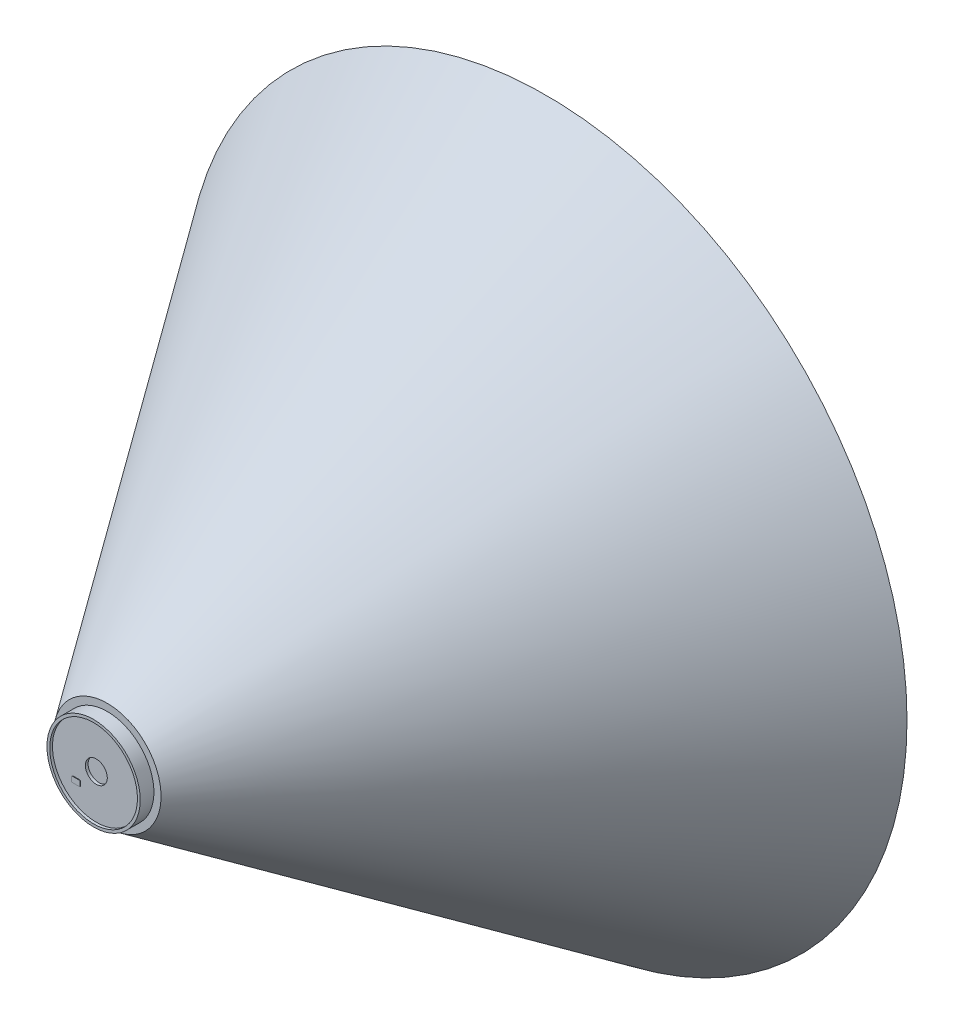
ISO-10303-21;
HEADER;
FILE_DESCRIPTION(('STEP AP214'),'2;1');
FILE_NAME('part.step','',(''),(''),'','','');
FILE_SCHEMA(('AUTOMOTIVE_DESIGN { 1 0 10303 214 1 1 1 1 }'));
ENDSEC;
DATA;
#1=APPLICATION_CONTEXT('core data for automotive mechanical design processes');
#2=APPLICATION_PROTOCOL_DEFINITION('international standard','automotive_design',2000,#1);
#3=PRODUCT_CONTEXT('',#1,'mechanical');
#4=PRODUCT('Part','Part','',(#3));
#5=PRODUCT_RELATED_PRODUCT_CATEGORY('part','',(#4));
#6=PRODUCT_DEFINITION_FORMATION('','',#4);
#7=PRODUCT_DEFINITION_CONTEXT('part definition',#1,'design');
#8=PRODUCT_DEFINITION('design','',#6,#7);
#9=PRODUCT_DEFINITION_SHAPE('','',#8);
#10=(LENGTH_UNIT() NAMED_UNIT(*) SI_UNIT(.MILLI.,.METRE.));
#11=(NAMED_UNIT(*) PLANE_ANGLE_UNIT() SI_UNIT($,.RADIAN.));
#12=(NAMED_UNIT(*) SI_UNIT($,.STERADIAN.) SOLID_ANGLE_UNIT());
#13=UNCERTAINTY_MEASURE_WITH_UNIT(LENGTH_MEASURE(1.E-05),#10,'distance_accuracy_value','');
#14=(GEOMETRIC_REPRESENTATION_CONTEXT(3) GLOBAL_UNCERTAINTY_ASSIGNED_CONTEXT((#13)) GLOBAL_UNIT_ASSIGNED_CONTEXT((#10,
#11,#12)) REPRESENTATION_CONTEXT('',''));
#15=CARTESIAN_POINT('',(0.,0.,0.));
#16=DIRECTION('',(0.,0.,1.));
#17=DIRECTION('',(1.,0.,0.));
#18=AXIS2_PLACEMENT_3D('',#15,#16,#17);
#19=CARTESIAN_POINT('',(0.,0.,0.));
#20=DIRECTION('',(0.,0.,-1.));
#21=DIRECTION('',(-1.,0.,0.));
#22=AXIS2_PLACEMENT_3D('',#19,#20,#21);
#23=PLANE('',#22);
#24=CARTESIAN_POINT('',(0.,0.,0.));
#25=DIRECTION('',(0.,0.,-1.));
#26=DIRECTION('',(-1.,0.,0.));
#27=AXIS2_PLACEMENT_3D('',#24,#25,#26);
#28=CIRCLE('',#27,425.);
#29=CARTESIAN_POINT('',(-425.,0.,0.));
#30=VERTEX_POINT('',#29);
#31=EDGE_CURVE('E11',#30,#30,#28,.F.);
#32=ORIENTED_EDGE('',*,*,#31,.F.);
#33=EDGE_LOOP('',(#32));
#34=FACE_BOUND('',#33,.T.);
#35=CARTESIAN_POINT('',(0.,0.,0.));
#36=DIRECTION('',(0.,0.,1.));
#37=DIRECTION('',(1.,0.,0.));
#38=AXIS2_PLACEMENT_3D('',#35,#36,#37);
#39=CIRCLE('',#38,490.113460197904);
#40=CARTESIAN_POINT('',(-490.113460197904,0.,0.));
#41=VERTEX_POINT('',#40);
#42=EDGE_CURVE('E50',#41,#41,#39,.T.);
#43=ORIENTED_EDGE('',*,*,#42,.T.);
#44=EDGE_LOOP('',(#43));
#45=FACE_BOUND('',#44,.T.);
#46=ADVANCED_FACE('F41',(#34,#45),#23,.F.);
#47=CARTESIAN_POINT('',(0.,0.,-4000.));
#48=DIRECTION('',(0.,0.,-1.));
#49=DIRECTION('',(-1.,0.,0.));
#50=AXIS2_PLACEMENT_3D('',#47,#48,#49);
#51=CONICAL_SURFACE('',#50,3290.94361303677,0.61086523819802);
#52=CARTESIAN_POINT('',(0.,0.,-4000.));
#53=DIRECTION('',(0.,0.,1.));
#54=DIRECTION('',(1.,0.,0.));
#55=AXIS2_PLACEMENT_3D('',#52,#53,#54);
#56=CIRCLE('',#55,3290.94361303677);
#57=CARTESIAN_POINT('',(-3290.94361303677,0.,-4000.));
#58=VERTEX_POINT('',#57);
#59=EDGE_CURVE('E200',#58,#58,#56,.T.);
#60=CARTESIAN_POINT('',(-490.113460197904,0.,0.));
#61=CARTESIAN_POINT('',(-519.288774289975,0.,-41.6666666666667));
#62=CARTESIAN_POINT('',(-548.464088382047,0.,-83.3333333333333));
#63=CARTESIAN_POINT('',(-606.81471656619,0.,-166.666666666667));
#64=CARTESIAN_POINT('',(-635.990030658262,0.,-208.333333333333));
#65=CARTESIAN_POINT('',(-694.340658842405,0.,-291.666666666667));
#66=CARTESIAN_POINT('',(-723.515972934476,0.,-333.333333333333));
#67=CARTESIAN_POINT('',(-781.866601118619,0.,-416.666666666667));
#68=CARTESIAN_POINT('',(-811.041915210691,0.,-458.333333333333));
#69=CARTESIAN_POINT('',(-869.392543394834,0.,-541.666666666667));
#70=CARTESIAN_POINT('',(-898.567857486905,0.,-583.333333333333));
#71=CARTESIAN_POINT('',(-956.918485671048,0.,-666.666666666667));
#72=CARTESIAN_POINT('',(-986.09379976312,0.,-708.333333333333));
#73=CARTESIAN_POINT('',(-1044.44442794726,0.,-791.666666666667));
#74=CARTESIAN_POINT('',(-1073.61974203933,0.,-833.333333333333));
#75=CARTESIAN_POINT('',(-1131.97037022348,0.,-916.666666666667));
#76=CARTESIAN_POINT('',(-1161.14568431555,0.,-958.333333333333));
#77=CARTESIAN_POINT('',(-1219.49631249969,0.,-1041.66666666667));
#78=CARTESIAN_POINT('',(-1248.67162659176,0.,-1083.33333333333));
#79=CARTESIAN_POINT('',(-1307.02225477591,0.,-1166.66666666667));
#80=CARTESIAN_POINT('',(-1336.19756886798,0.,-1208.33333333333));
#81=CARTESIAN_POINT('',(-1394.54819705212,0.,-1291.66666666667));
#82=CARTESIAN_POINT('',(-1423.72351114419,0.,-1333.33333333333));
#83=CARTESIAN_POINT('',(-1482.07413932834,0.,-1416.66666666667));
#84=CARTESIAN_POINT('',(-1511.24945342041,0.,-1458.33333333333));
#85=CARTESIAN_POINT('',(-1569.60008160455,0.,-1541.66666666667));
#86=CARTESIAN_POINT('',(-1598.77539569662,0.,-1583.33333333333));
#87=CARTESIAN_POINT('',(-1657.12602388077,0.,-1666.66666666667));
#88=CARTESIAN_POINT('',(-1686.30133797284,0.,-1708.33333333333));
#89=CARTESIAN_POINT('',(-1744.65196615698,0.,-1791.66666666667));
#90=CARTESIAN_POINT('',(-1773.82728024905,0.,-1833.33333333333));
#91=CARTESIAN_POINT('',(-1832.17790843319,0.,-1916.66666666667));
#92=CARTESIAN_POINT('',(-1861.35322252527,0.,-1958.33333333333));
#93=CARTESIAN_POINT('',(-1919.70385070941,0.,-2041.66666666667));
#94=CARTESIAN_POINT('',(-1948.87916480148,0.,-2083.33333333333));
#95=CARTESIAN_POINT('',(-2007.22979298562,0.,-2166.66666666667));
#96=CARTESIAN_POINT('',(-2036.40510707769,0.,-2208.33333333333));
#97=CARTESIAN_POINT('',(-2094.75573526184,0.,-2291.66666666667));
#98=CARTESIAN_POINT('',(-2123.93104935391,0.,-2333.33333333333));
#99=CARTESIAN_POINT('',(-2182.28167753805,0.,-2416.66666666667));
#100=CARTESIAN_POINT('',(-2211.45699163012,0.,-2458.33333333333));
#101=CARTESIAN_POINT('',(-2269.80761981427,0.,-2541.66666666667));
#102=CARTESIAN_POINT('',(-2298.98293390634,0.,-2583.33333333333));
#103=CARTESIAN_POINT('',(-2357.33356209048,0.,-2666.66666666667));
#104=CARTESIAN_POINT('',(-2386.50887618255,0.,-2708.33333333333));
#105=CARTESIAN_POINT('',(-2444.8595043667,0.,-2791.66666666667));
#106=CARTESIAN_POINT('',(-2474.03481845877,0.,-2833.33333333333));
#107=CARTESIAN_POINT('',(-2532.38544664291,0.,-2916.66666666667));
#108=CARTESIAN_POINT('',(-2561.56076073498,0.,-2958.33333333333));
#109=CARTESIAN_POINT('',(-2619.91138891913,0.,-3041.66666666667));
#110=CARTESIAN_POINT('',(-2649.0867030112,0.,-3083.33333333333));
#111=CARTESIAN_POINT('',(-2707.43733119534,0.,-3166.66666666667));
#112=CARTESIAN_POINT('',(-2736.61264528741,0.,-3208.33333333333));
#113=CARTESIAN_POINT('',(-2794.96327347155,0.,-3291.66666666667));
#114=CARTESIAN_POINT('',(-2824.13858756363,0.,-3333.33333333333));
#115=CARTESIAN_POINT('',(-2882.48921574777,0.,-3416.66666666667));
#116=CARTESIAN_POINT('',(-2911.66452983984,0.,-3458.33333333333));
#117=CARTESIAN_POINT('',(-2970.01515802398,0.,-3541.66666666667));
#118=CARTESIAN_POINT('',(-2999.19047211606,0.,-3583.33333333333));
#119=CARTESIAN_POINT('',(-3057.5411003002,0.,-3666.66666666667));
#120=CARTESIAN_POINT('',(-3086.71641439227,0.,-3708.33333333333));
#121=CARTESIAN_POINT('',(-3145.06704257641,0.,-3791.66666666667));
#122=CARTESIAN_POINT('',(-3174.24235666849,0.,-3833.33333333333));
#123=CARTESIAN_POINT('',(-3232.59298485263,0.,-3916.66666666667));
#124=CARTESIAN_POINT('',(-3261.7682989447,0.,-3958.33333333333));
#125=CARTESIAN_POINT('',(-3290.94361303677,0.,-4000.));
#126=B_SPLINE_CURVE_WITH_KNOTS('',3,(#60,#61,#62,#63,#64,#65,#66,#67,#68,#69,#70,#71,#72,#73,
#74,#75,#76,#77,#78,#79,#80,#81,#82,#83,#84,#85,#86,#87,#88,#89,#90,#91,#92,#93,#94,#95,#96,#97,
#98,#99,#100,#101,#102,#103,#104,#105,#106,#107,#108,#109,#110,#111,#112,#113,#114,#115,#116,
#117,#118,#119,#120,#121,#122,#123,#124,#125),.UNSPECIFIED.,.F.,.F.,(4,2,2,2,2,2,2,2,2,2,2,2,2,
2,2,2,2,2,2,2,2,2,2,2,2,2,2,2,2,2,2,2,4),(0.,152.596823595183,305.193647190365,457.790470785548,
610.38729438073,762.984117975913,915.580941571095,1068.17776516628,1220.77458876146,
1373.37141235664,1525.96823595183,1678.56505954701,1831.16188314219,1983.75870673737,
2136.35553033256,2288.95235392774,2441.54917752292,2594.1460011181,2746.74282471328,
2899.33964830847,3051.93647190365,3204.53329549883,3357.13011909402,3509.7269426892,
3662.32376628438,3814.92058987956,3967.51741347475,4120.11423706993,4272.71106066511,
4425.30788426029,4577.90470785547,4730.50153145066,4883.09835504584),.UNSPECIFIED.);
#127=EDGE_CURVE('BSEAM208',#41,#58,#126,.T.);
#128=ORIENTED_EDGE('',*,*,#42,.F.);
#129=ORIENTED_EDGE('',*,*,#59,.T.);
#130=ORIENTED_EDGE('',*,*,#127,.T.);
#131=ORIENTED_EDGE('',*,*,#127,.F.);
#132=EDGE_LOOP('',(#128,#130,#129,#131));
#133=FACE_BOUND('',#132,.T.);
#134=ADVANCED_FACE('F208',(#133),#51,.T.);
#135=CARTESIAN_POINT('',(0.,0.,-4000.));
#136=DIRECTION('',(0.,0.,1.));
#137=DIRECTION('',(1.,0.,0.));
#138=AXIS2_PLACEMENT_3D('',#135,#136,#137);
#139=PLANE('',#138);
#140=ORIENTED_EDGE('',*,*,#59,.F.);
#141=EDGE_LOOP('',(#140));
#142=FACE_BOUND('',#141,.T.);
#143=ADVANCED_FACE('F211',(#142),#139,.F.);
#144=CARTESIAN_POINT('',(0.,0.,100.));
#145=DIRECTION('',(0.,0.,1.));
#146=DIRECTION('',(1.,0.,0.));
#147=AXIS2_PLACEMENT_3D('',#144,#145,#146);
#148=PLANE('',#147);
#149=CARTESIAN_POINT('',(0.,0.,100.));
#150=DIRECTION('',(0.,0.,1.));
#151=DIRECTION('',(1.,0.,0.));
#152=AXIS2_PLACEMENT_3D('',#149,#150,#151);
#153=CIRCLE('',#152,400.);
#154=CARTESIAN_POINT('',(400.,0.,100.));
#155=VERTEX_POINT('',#154);
#156=EDGE_CURVE('E136',#155,#155,#153,.F.);
#157=ORIENTED_EDGE('',*,*,#156,.F.);
#158=EDGE_LOOP('',(#157));
#159=FACE_BOUND('',#158,.T.);
#160=CARTESIAN_POINT('',(0.,0.,100.));
#161=DIRECTION('',(0.,0.,1.));
#162=DIRECTION('',(1.,0.,0.));
#163=AXIS2_PLACEMENT_3D('',#160,#161,#162);
#164=CIRCLE('',#163,100.);
#165=CARTESIAN_POINT('',(100.,0.,100.));
#166=VERTEX_POINT('',#165);
#167=EDGE_CURVE('E155',#166,#166,#164,.T.);
#168=ORIENTED_EDGE('',*,*,#167,.F.);
#169=EDGE_LOOP('',(#168));
#170=FACE_BOUND('',#169,.T.);
#171=DIRECTION('',(1.,0.,0.));
#172=VECTOR('',#171,1.);
#173=CARTESIAN_POINT('',(-220.,-190.,100.));
#174=LINE('',#173,#172);
#175=CARTESIAN_POINT('',(-215.,-190.,100.));
#176=VERTEX_POINT('',#175);
#177=CARTESIAN_POINT('',(-150.,-190.,100.));
#178=VERTEX_POINT('',#177);
#179=EDGE_CURVE('E135',#176,#178,#174,.T.);
#180=ORIENTED_EDGE('',*,*,#179,.F.);
#181=CARTESIAN_POINT('',(-215.,-185.,100.));
#182=DIRECTION('',(0.,0.,1.));
#183=DIRECTION('',(1.,0.,0.));
#184=AXIS2_PLACEMENT_3D('',#181,#182,#183);
#185=CIRCLE('',#184,5.);
#186=CARTESIAN_POINT('',(-220.,-185.,100.));
#187=VERTEX_POINT('',#186);
#188=EDGE_CURVE('E65',#176,#187,#185,.F.);
#189=ORIENTED_EDGE('',*,*,#188,.T.);
#190=DIRECTION('',(0.,-1.,0.));
#191=VECTOR('',#190,1.);
#192=CARTESIAN_POINT('',(-220.,-140.,100.));
#193=LINE('',#192,#191);
#194=CARTESIAN_POINT('',(-220.,-145.,100.));
#195=VERTEX_POINT('',#194);
#196=EDGE_CURVE('E126',#195,#187,#193,.T.);
#197=ORIENTED_EDGE('',*,*,#196,.F.);
#198=CARTESIAN_POINT('',(-215.,-145.,100.));
#199=DIRECTION('',(0.,0.,1.));
#200=DIRECTION('',(1.,0.,0.));
#201=AXIS2_PLACEMENT_3D('',#198,#199,#200);
#202=CIRCLE('',#201,5.);
#203=CARTESIAN_POINT('',(-215.,-140.,100.));
#204=VERTEX_POINT('',#203);
#205=EDGE_CURVE('E109',#195,#204,#202,.F.);
#206=ORIENTED_EDGE('',*,*,#205,.T.);
#207=DIRECTION('',(-1.,0.,0.));
#208=VECTOR('',#207,1.);
#209=CARTESIAN_POINT('',(-220.,-140.,100.));
#210=LINE('',#209,#208);
#211=CARTESIAN_POINT('',(-150.,-140.,100.));
#212=VERTEX_POINT('',#211);
#213=EDGE_CURVE('E152',#212,#204,#210,.T.);
#214=ORIENTED_EDGE('',*,*,#213,.F.);
#215=CARTESIAN_POINT('',(-150.,-145.,100.));
#216=DIRECTION('',(0.,0.,1.));
#217=DIRECTION('',(1.,0.,0.));
#218=AXIS2_PLACEMENT_3D('',#215,#216,#217);
#219=CIRCLE('',#218,5.);
#220=CARTESIAN_POINT('',(-145.,-145.,100.));
#221=VERTEX_POINT('',#220);
#222=EDGE_CURVE('E119',#212,#221,#219,.F.);
#223=ORIENTED_EDGE('',*,*,#222,.T.);
#224=DIRECTION('',(0.,1.,0.));
#225=VECTOR('',#224,1.);
#226=CARTESIAN_POINT('',(-145.,-140.,100.));
#227=LINE('',#226,#225);
#228=CARTESIAN_POINT('',(-145.,-185.,100.));
#229=VERTEX_POINT('',#228);
#230=EDGE_CURVE('E140',#229,#221,#227,.T.);
#231=ORIENTED_EDGE('',*,*,#230,.F.);
#232=CARTESIAN_POINT('',(-150.,-185.,100.));
#233=DIRECTION('',(0.,0.,1.));
#234=DIRECTION('',(1.,0.,0.));
#235=AXIS2_PLACEMENT_3D('',#232,#233,#234);
#236=CIRCLE('',#235,5.);
#237=EDGE_CURVE('E57',#229,#178,#236,.F.);
#238=ORIENTED_EDGE('',*,*,#237,.T.);
#239=EDGE_LOOP('',(#180,#189,#197,#206,#214,#223,#231,#238));
#240=FACE_BOUND('',#239,.T.);
#241=ADVANCED_FACE('F133',(#159,#170,#240),#148,.T.);
#242=CARTESIAN_POINT('',(0.,0.,100.));
#243=DIRECTION('',(0.,0.,-1.));
#244=DIRECTION('',(-1.,0.,0.));
#245=AXIS2_PLACEMENT_3D('',#242,#243,#244);
#246=CYLINDRICAL_SURFACE('',#245,100.);
#247=CARTESIAN_POINT('',(0.,0.,75.));
#248=DIRECTION('',(0.,0.,1.));
#249=DIRECTION('',(1.,0.,0.));
#250=AXIS2_PLACEMENT_3D('',#247,#248,#249);
#251=CIRCLE('',#250,100.);
#252=CARTESIAN_POINT('',(100.,0.,75.));
#253=VERTEX_POINT('',#252);
#254=EDGE_CURVE('E196',#253,#253,#251,.F.);
#255=ORIENTED_EDGE('',*,*,#254,.T.);
#256=EDGE_LOOP('',(#255));
#257=FACE_BOUND('',#256,.T.);
#258=ORIENTED_EDGE('',*,*,#167,.T.);
#259=EDGE_LOOP('',(#258));
#260=FACE_BOUND('',#259,.T.);
#261=ADVANCED_FACE('F220',(#257,#260),#246,.F.);
#262=CARTESIAN_POINT('',(-220.,-140.,105.));
#263=DIRECTION('',(1.,0.,0.));
#264=DIRECTION('',(0.,0.,-1.));
#265=AXIS2_PLACEMENT_3D('',#262,#263,#264);
#266=PLANE('',#265);
#267=DIRECTION('',(0.,-1.,0.));
#268=VECTOR('',#267,1.);
#269=CARTESIAN_POINT('',(-220.,-140.,105.));
#270=LINE('',#269,#268);
#271=CARTESIAN_POINT('',(-220.,-145.,105.));
#272=VERTEX_POINT('',#271);
#273=CARTESIAN_POINT('',(-220.,-185.,105.));
#274=VERTEX_POINT('',#273);
#275=EDGE_CURVE('E128',#272,#274,#270,.T.);
#276=ORIENTED_EDGE('',*,*,#275,.F.);
#277=DIRECTION('',(0.,0.,-1.));
#278=VECTOR('',#277,1.);
#279=CARTESIAN_POINT('',(-220.,-145.,105.));
#280=LINE('',#279,#278);
#281=EDGE_CURVE('E113',#272,#195,#280,.T.);
#282=ORIENTED_EDGE('',*,*,#281,.T.);
#283=ORIENTED_EDGE('',*,*,#196,.T.);
#284=DIRECTION('',(0.,0.,-1.));
#285=VECTOR('',#284,1.);
#286=CARTESIAN_POINT('',(-220.,-185.,105.));
#287=LINE('',#286,#285);
#288=EDGE_CURVE('E131',#187,#274,#287,.F.);
#289=ORIENTED_EDGE('',*,*,#288,.T.);
#290=EDGE_LOOP('',(#276,#282,#283,#289));
#291=FACE_BOUND('',#290,.T.);
#292=ADVANCED_FACE('F125',(#291),#266,.F.);
#293=CARTESIAN_POINT('',(-220.,-190.,105.));
#294=DIRECTION('',(0.,1.,0.));
#295=DIRECTION('',(0.,0.,1.));
#296=AXIS2_PLACEMENT_3D('',#293,#294,#295);
#297=PLANE('',#296);
#298=ORIENTED_EDGE('',*,*,#179,.T.);
#299=DIRECTION('',(0.,0.,-1.));
#300=VECTOR('',#299,1.);
#301=CARTESIAN_POINT('',(-150.,-190.,105.));
#302=LINE('',#301,#300);
#303=CARTESIAN_POINT('',(-150.,-190.,105.));
#304=VERTEX_POINT('',#303);
#305=EDGE_CURVE('E120',#178,#304,#302,.F.);
#306=ORIENTED_EDGE('',*,*,#305,.T.);
#307=DIRECTION('',(1.,0.,0.));
#308=VECTOR('',#307,1.);
#309=CARTESIAN_POINT('',(-220.,-190.,105.));
#310=LINE('',#309,#308);
#311=CARTESIAN_POINT('',(-215.,-190.,105.));
#312=VERTEX_POINT('',#311);
#313=EDGE_CURVE('E286',#312,#304,#310,.T.);
#314=ORIENTED_EDGE('',*,*,#313,.F.);
#315=DIRECTION('',(0.,0.,-1.));
#316=VECTOR('',#315,1.);
#317=CARTESIAN_POINT('',(-215.,-190.,105.));
#318=LINE('',#317,#316);
#319=EDGE_CURVE('E185',#312,#176,#318,.T.);
#320=ORIENTED_EDGE('',*,*,#319,.T.);
#321=EDGE_LOOP('',(#298,#306,#314,#320));
#322=FACE_BOUND('',#321,.T.);
#323=ADVANCED_FACE('F257',(#322),#297,.F.);
#324=CARTESIAN_POINT('',(-145.,-140.,105.));
#325=DIRECTION('',(-1.,0.,0.));
#326=DIRECTION('',(0.,-1.,0.));
#327=AXIS2_PLACEMENT_3D('',#324,#325,#326);
#328=PLANE('',#327);
#329=ORIENTED_EDGE('',*,*,#230,.T.);
#330=DIRECTION('',(0.,0.,-1.));
#331=VECTOR('',#330,1.);
#332=CARTESIAN_POINT('',(-145.,-145.,105.));
#333=LINE('',#332,#331);
#334=CARTESIAN_POINT('',(-145.,-145.,105.));
#335=VERTEX_POINT('',#334);
#336=EDGE_CURVE('E182',#221,#335,#333,.F.);
#337=ORIENTED_EDGE('',*,*,#336,.T.);
#338=DIRECTION('',(0.,1.,0.));
#339=VECTOR('',#338,1.);
#340=CARTESIAN_POINT('',(-145.,-140.,105.));
#341=LINE('',#340,#339);
#342=CARTESIAN_POINT('',(-145.,-185.,105.));
#343=VERTEX_POINT('',#342);
#344=EDGE_CURVE('E290',#343,#335,#341,.T.);
#345=ORIENTED_EDGE('',*,*,#344,.F.);
#346=DIRECTION('',(0.,0.,-1.));
#347=VECTOR('',#346,1.);
#348=CARTESIAN_POINT('',(-145.,-185.,105.));
#349=LINE('',#348,#347);
#350=EDGE_CURVE('E178',#343,#229,#349,.T.);
#351=ORIENTED_EDGE('',*,*,#350,.T.);
#352=EDGE_LOOP('',(#329,#337,#345,#351));
#353=FACE_BOUND('',#352,.T.);
#354=ADVANCED_FACE('F253',(#353),#328,.F.);
#355=CARTESIAN_POINT('',(-220.,-140.,105.));
#356=DIRECTION('',(0.,-1.,0.));
#357=DIRECTION('',(1.,0.,0.));
#358=AXIS2_PLACEMENT_3D('',#355,#356,#357);
#359=PLANE('',#358);
#360=ORIENTED_EDGE('',*,*,#213,.T.);
#361=DIRECTION('',(0.,0.,-1.));
#362=VECTOR('',#361,1.);
#363=CARTESIAN_POINT('',(-215.,-140.,105.));
#364=LINE('',#363,#362);
#365=CARTESIAN_POINT('',(-215.,-140.,105.));
#366=VERTEX_POINT('',#365);
#367=EDGE_CURVE('E114',#204,#366,#364,.F.);
#368=ORIENTED_EDGE('',*,*,#367,.T.);
#369=DIRECTION('',(-1.,0.,0.));
#370=VECTOR('',#369,1.);
#371=CARTESIAN_POINT('',(-220.,-140.,105.));
#372=LINE('',#371,#370);
#373=CARTESIAN_POINT('',(-150.,-140.,105.));
#374=VERTEX_POINT('',#373);
#375=EDGE_CURVE('E146',#374,#366,#372,.T.);
#376=ORIENTED_EDGE('',*,*,#375,.F.);
#377=DIRECTION('',(0.,0.,-1.));
#378=VECTOR('',#377,1.);
#379=CARTESIAN_POINT('',(-150.,-140.,105.));
#380=LINE('',#379,#378);
#381=EDGE_CURVE('E130',#374,#212,#380,.T.);
#382=ORIENTED_EDGE('',*,*,#381,.T.);
#383=EDGE_LOOP('',(#360,#368,#376,#382));
#384=FACE_BOUND('',#383,.T.);
#385=ADVANCED_FACE('F249',(#384),#359,.F.);
#386=CARTESIAN_POINT('',(0.,0.,105.));
#387=DIRECTION('',(0.,0.,1.));
#388=DIRECTION('',(1.,0.,0.));
#389=AXIS2_PLACEMENT_3D('',#386,#387,#388);
#390=PLANE('',#389);
#391=ORIENTED_EDGE('',*,*,#375,.T.);
#392=CARTESIAN_POINT('',(-215.,-145.,105.));
#393=DIRECTION('',(0.,0.,1.));
#394=DIRECTION('',(1.,0.,0.));
#395=AXIS2_PLACEMENT_3D('',#392,#393,#394);
#396=CIRCLE('',#395,5.);
#397=EDGE_CURVE('E175',#366,#272,#396,.T.);
#398=ORIENTED_EDGE('',*,*,#397,.T.);
#399=ORIENTED_EDGE('',*,*,#275,.T.);
#400=CARTESIAN_POINT('',(-215.,-185.,105.));
#401=DIRECTION('',(0.,0.,1.));
#402=DIRECTION('',(1.,0.,0.));
#403=AXIS2_PLACEMENT_3D('',#400,#401,#402);
#404=CIRCLE('',#403,5.);
#405=EDGE_CURVE('E166',#274,#312,#404,.T.);
#406=ORIENTED_EDGE('',*,*,#405,.T.);
#407=ORIENTED_EDGE('',*,*,#313,.T.);
#408=CARTESIAN_POINT('',(-150.,-185.,105.));
#409=DIRECTION('',(0.,0.,1.));
#410=DIRECTION('',(1.,0.,0.));
#411=AXIS2_PLACEMENT_3D('',#408,#409,#410);
#412=CIRCLE('',#411,5.);
#413=EDGE_CURVE('E169',#304,#343,#412,.T.);
#414=ORIENTED_EDGE('',*,*,#413,.T.);
#415=ORIENTED_EDGE('',*,*,#344,.T.);
#416=CARTESIAN_POINT('',(-150.,-145.,105.));
#417=DIRECTION('',(0.,0.,1.));
#418=DIRECTION('',(1.,0.,0.));
#419=AXIS2_PLACEMENT_3D('',#416,#417,#418);
#420=CIRCLE('',#419,5.);
#421=EDGE_CURVE('E172',#335,#374,#420,.T.);
#422=ORIENTED_EDGE('',*,*,#421,.T.);
#423=EDGE_LOOP('',(#391,#398,#399,#406,#407,#414,#415,#422));
#424=FACE_BOUND('',#423,.T.);
#425=ADVANCED_FACE('F242',(#424),#390,.T.);
#426=CARTESIAN_POINT('',(0.,0.,125.));
#427=DIRECTION('',(0.,0.,1.));
#428=DIRECTION('',(1.,0.,0.));
#429=AXIS2_PLACEMENT_3D('',#426,#427,#428);
#430=PLANE('',#429);
#431=CARTESIAN_POINT('',(0.,0.,125.));
#432=DIRECTION('',(0.,0.,1.));
#433=DIRECTION('',(1.,0.,0.));
#434=AXIS2_PLACEMENT_3D('',#431,#432,#433);
#435=CIRCLE('',#434,425.);
#436=CARTESIAN_POINT('',(425.,0.,125.));
#437=VERTEX_POINT('',#436);
#438=EDGE_CURVE('E143',#437,#437,#435,.T.);
#439=ORIENTED_EDGE('',*,*,#438,.T.);
#440=EDGE_LOOP('',(#439));
#441=FACE_BOUND('',#440,.T.);
#442=CARTESIAN_POINT('',(0.,0.,125.));
#443=DIRECTION('',(0.,0.,1.));
#444=DIRECTION('',(1.,0.,0.));
#445=AXIS2_PLACEMENT_3D('',#442,#443,#444);
#446=CIRCLE('',#445,400.);
#447=CARTESIAN_POINT('',(400.,0.,125.));
#448=VERTEX_POINT('',#447);
#449=EDGE_CURVE('E300',#448,#448,#446,.T.);
#450=ORIENTED_EDGE('',*,*,#449,.F.);
#451=EDGE_LOOP('',(#450));
#452=FACE_BOUND('',#451,.T.);
#453=ADVANCED_FACE('F233',(#441,#452),#430,.T.);
#454=CARTESIAN_POINT('',(0.,0.,125.));
#455=DIRECTION('',(0.,0.,-1.));
#456=DIRECTION('',(-1.,0.,0.));
#457=AXIS2_PLACEMENT_3D('',#454,#455,#456);
#458=CYLINDRICAL_SURFACE('',#457,425.);
#459=ORIENTED_EDGE('',*,*,#438,.F.);
#460=EDGE_LOOP('',(#459));
#461=FACE_BOUND('',#460,.T.);
#462=ORIENTED_EDGE('',*,*,#31,.T.);
#463=EDGE_LOOP('',(#462));
#464=FACE_BOUND('',#463,.T.);
#465=ADVANCED_FACE('F230',(#461,#464),#458,.T.);
#466=CARTESIAN_POINT('',(0.,0.,125.));
#467=DIRECTION('',(0.,0.,-1.));
#468=DIRECTION('',(-1.,0.,0.));
#469=AXIS2_PLACEMENT_3D('',#466,#467,#468);
#470=CYLINDRICAL_SURFACE('',#469,400.);
#471=ORIENTED_EDGE('',*,*,#156,.T.);
#472=EDGE_LOOP('',(#471));
#473=FACE_BOUND('',#472,.T.);
#474=ORIENTED_EDGE('',*,*,#449,.T.);
#475=EDGE_LOOP('',(#474));
#476=FACE_BOUND('',#475,.T.);
#477=ADVANCED_FACE('F232',(#473,#476),#470,.F.);
#478=CARTESIAN_POINT('',(-215.,-145.,105.));
#479=DIRECTION('',(0.,0.,-1.));
#480=DIRECTION('',(-1.,0.,0.));
#481=AXIS2_PLACEMENT_3D('',#478,#479,#480);
#482=CYLINDRICAL_SURFACE('',#481,5.);
#483=ORIENTED_EDGE('',*,*,#397,.F.);
#484=ORIENTED_EDGE('',*,*,#367,.F.);
#485=ORIENTED_EDGE('',*,*,#205,.F.);
#486=ORIENTED_EDGE('',*,*,#281,.F.);
#487=EDGE_LOOP('',(#483,#484,#485,#486));
#488=FACE_BOUND('',#487,.T.);
#489=ADVANCED_FACE('F112',(#488),#482,.T.);
#490=CARTESIAN_POINT('',(-150.,-145.,105.));
#491=DIRECTION('',(0.,0.,-1.));
#492=DIRECTION('',(-1.,0.,0.));
#493=AXIS2_PLACEMENT_3D('',#490,#491,#492);
#494=CYLINDRICAL_SURFACE('',#493,5.);
#495=ORIENTED_EDGE('',*,*,#421,.F.);
#496=ORIENTED_EDGE('',*,*,#336,.F.);
#497=ORIENTED_EDGE('',*,*,#222,.F.);
#498=ORIENTED_EDGE('',*,*,#381,.F.);
#499=EDGE_LOOP('',(#495,#496,#497,#498));
#500=FACE_BOUND('',#499,.T.);
#501=ADVANCED_FACE('F269',(#500),#494,.T.);
#502=CARTESIAN_POINT('',(-150.,-185.,105.));
#503=DIRECTION('',(0.,0.,-1.));
#504=DIRECTION('',(-1.,0.,0.));
#505=AXIS2_PLACEMENT_3D('',#502,#503,#504);
#506=CYLINDRICAL_SURFACE('',#505,5.);
#507=ORIENTED_EDGE('',*,*,#413,.F.);
#508=ORIENTED_EDGE('',*,*,#305,.F.);
#509=ORIENTED_EDGE('',*,*,#237,.F.);
#510=ORIENTED_EDGE('',*,*,#350,.F.);
#511=EDGE_LOOP('',(#507,#508,#509,#510));
#512=FACE_BOUND('',#511,.T.);
#513=ADVANCED_FACE('F272',(#512),#506,.T.);
#514=CARTESIAN_POINT('',(-215.,-185.,105.));
#515=DIRECTION('',(0.,0.,-1.));
#516=DIRECTION('',(-1.,0.,0.));
#517=AXIS2_PLACEMENT_3D('',#514,#515,#516);
#518=CYLINDRICAL_SURFACE('',#517,5.);
#519=ORIENTED_EDGE('',*,*,#405,.F.);
#520=ORIENTED_EDGE('',*,*,#288,.F.);
#521=ORIENTED_EDGE('',*,*,#188,.F.);
#522=ORIENTED_EDGE('',*,*,#319,.F.);
#523=EDGE_LOOP('',(#519,#520,#521,#522));
#524=FACE_BOUND('',#523,.T.);
#525=ADVANCED_FACE('F275',(#524),#518,.T.);
#526=CARTESIAN_POINT('',(0.,0.,75.));
#527=DIRECTION('',(0.,0.,1.));
#528=DIRECTION('',(1.,0.,0.));
#529=AXIS2_PLACEMENT_3D('',#526,#527,#528);
#530=PLANE('',#529);
#531=ORIENTED_EDGE('',*,*,#254,.F.);
#532=EDGE_LOOP('',(#531));
#533=FACE_BOUND('',#532,.T.);
#534=ADVANCED_FACE('F43',(#533),#530,.T.);
#535=CLOSED_SHELL('',(#46,#134,#143,#241,#261,#292,#323,#354,#385,#425,#453,#465,#477,#489,#501,
#513,#525,#534));
#536=MANIFOLD_SOLID_BREP('B2',#535);
#537=ADVANCED_BREP_SHAPE_REPRESENTATION('',(#18,#536),#14);
#538=SHAPE_DEFINITION_REPRESENTATION(#9,#537);
ENDSEC;
END-ISO-10303-21;
